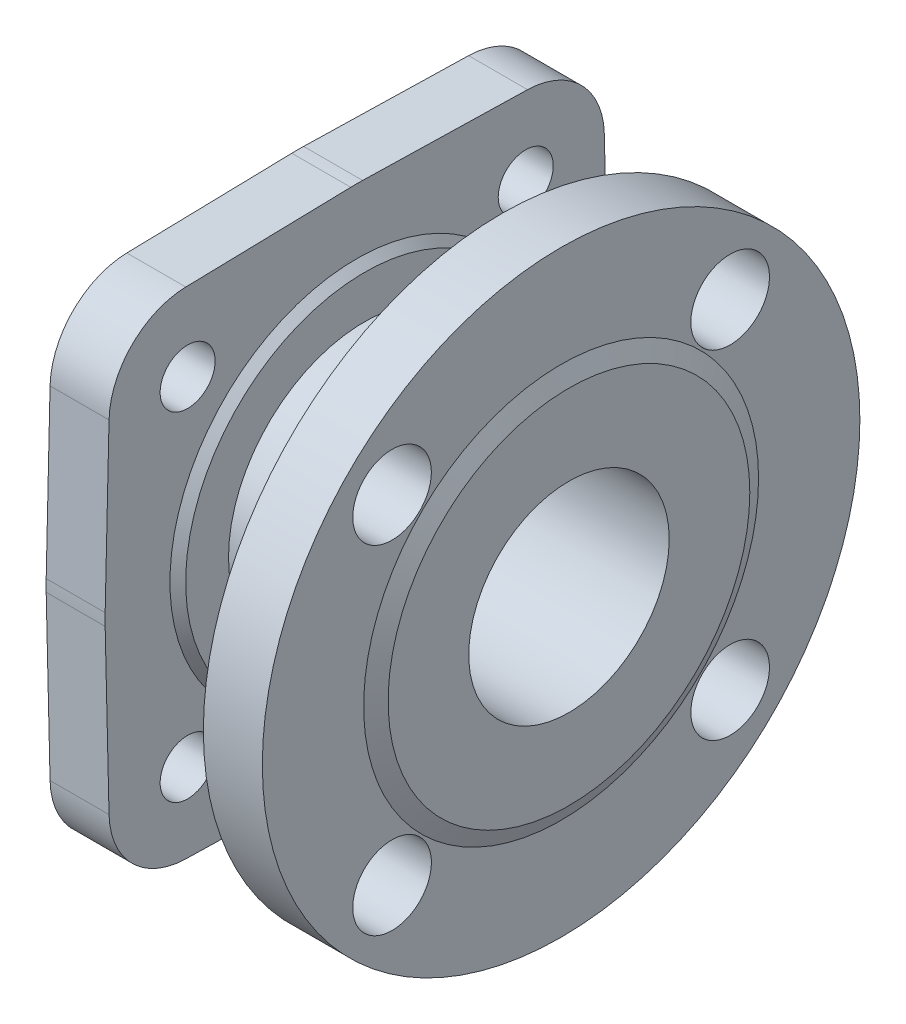
ISO-10303-21;
HEADER;
FILE_DESCRIPTION(('STEP AP214'),'2;1');
FILE_NAME('part.step','',(''),(''),'','','');
FILE_SCHEMA(('AUTOMOTIVE_DESIGN { 1 0 10303 214 1 1 1 1 }'));
ENDSEC;
DATA;
#1=APPLICATION_CONTEXT('core data for automotive mechanical design processes');
#2=APPLICATION_PROTOCOL_DEFINITION('international standard','automotive_design',2000,#1);
#3=PRODUCT_CONTEXT('',#1,'mechanical');
#4=PRODUCT('Part','Part','',(#3));
#5=PRODUCT_RELATED_PRODUCT_CATEGORY('part','',(#4));
#6=PRODUCT_DEFINITION_FORMATION('','',#4);
#7=PRODUCT_DEFINITION_CONTEXT('part definition',#1,'design');
#8=PRODUCT_DEFINITION('design','',#6,#7);
#9=PRODUCT_DEFINITION_SHAPE('','',#8);
#10=(LENGTH_UNIT() NAMED_UNIT(*) SI_UNIT(.MILLI.,.METRE.));
#11=(NAMED_UNIT(*) PLANE_ANGLE_UNIT() SI_UNIT($,.RADIAN.));
#12=(NAMED_UNIT(*) SI_UNIT($,.STERADIAN.) SOLID_ANGLE_UNIT());
#13=UNCERTAINTY_MEASURE_WITH_UNIT(LENGTH_MEASURE(1.E-05),#10,'distance_accuracy_value','');
#14=(GEOMETRIC_REPRESENTATION_CONTEXT(3) GLOBAL_UNCERTAINTY_ASSIGNED_CONTEXT((#13)) GLOBAL_UNIT_ASSIGNED_CONTEXT((#10,
#11,#12)) REPRESENTATION_CONTEXT('',''));
#15=CARTESIAN_POINT('',(0.,0.,0.));
#16=DIRECTION('',(0.,0.,1.));
#17=DIRECTION('',(1.,0.,0.));
#18=AXIS2_PLACEMENT_3D('',#15,#16,#17);
#19=CARTESIAN_POINT('',(15.,-1.50609583357717,-63.9822762594461));
#20=DIRECTION('',(0.,0.0235327473996433,0.999723066553845));
#21=DIRECTION('',(0.,-0.999723066553845,0.0235327473996433));
#22=AXIS2_PLACEMENT_3D('',#19,#20,#21);
#23=PLANE('',#22);
#24=DIRECTION('',(0.,0.999723066553846,-0.0235327473996433));
#25=VECTOR('',#24,1.);
#26=CARTESIAN_POINT('',(0.,-1.50609583357717,-63.9822762594461));
#27=LINE('',#26,#25);
#28=CARTESIAN_POINT('',(0.,-43.4706549479929,-62.9944613310769));
#29=VERTEX_POINT('',#28);
#30=CARTESIAN_POINT('',(0.,-1.50609583357715,-63.9822762594461));
#31=VERTEX_POINT('',#30);
#32=EDGE_CURVE('E196',#29,#31,#27,.T.);
#33=ORIENTED_EDGE('',*,*,#32,.T.);
#34=DIRECTION('',(-1.,0.,0.));
#35=VECTOR('',#34,1.);
#36=CARTESIAN_POINT('',(15.,-1.50609583357715,-63.9822762594461));
#37=LINE('',#36,#35);
#38=CARTESIAN_POINT('',(15.,-1.50609583357715,-63.9822762594461));
#39=VERTEX_POINT('',#38);
#40=EDGE_CURVE('E48',#39,#31,#37,.T.);
#41=ORIENTED_EDGE('',*,*,#40,.F.);
#42=DIRECTION('',(0.,0.999723066553846,-0.0235327473996433));
#43=VECTOR('',#42,1.);
#44=CARTESIAN_POINT('',(15.,-1.50609583357717,-63.9822762594461));
#45=LINE('',#44,#43);
#46=CARTESIAN_POINT('',(15.,-43.4706549479929,-62.9944613310769));
#47=VERTEX_POINT('',#46);
#48=EDGE_CURVE('E253',#47,#39,#45,.T.);
#49=ORIENTED_EDGE('',*,*,#48,.F.);
#50=DIRECTION('',(-1.,0.,0.));
#51=VECTOR('',#50,1.);
#52=CARTESIAN_POINT('',(15.,-43.4706549479929,-62.9944613310769));
#53=LINE('',#52,#51);
#54=EDGE_CURVE('E63',#47,#29,#53,.T.);
#55=ORIENTED_EDGE('',*,*,#54,.T.);
#56=EDGE_LOOP('',(#33,#41,#49,#55));
#57=FACE_BOUND('',#56,.T.);
#58=ADVANCED_FACE('F45',(#57),#23,.F.);
#59=CARTESIAN_POINT('',(15.,0.,0.));
#60=DIRECTION('',(-1.,0.,0.));
#61=DIRECTION('',(0.,0.,1.));
#62=AXIS2_PLACEMENT_3D('',#59,#60,#61);
#63=CYLINDRICAL_SURFACE('',#62,64.);
#64=CARTESIAN_POINT('',(0.,0.,0.));
#65=DIRECTION('',(1.,0.,0.));
#66=DIRECTION('',(0.,0.,-1.));
#67=AXIS2_PLACEMENT_3D('',#64,#65,#66);
#68=CIRCLE('',#67,64.);
#69=CARTESIAN_POINT('',(0.,1.50609583357715,-63.9822762594461));
#70=VERTEX_POINT('',#69);
#71=EDGE_CURVE('E199',#31,#70,#68,.T.);
#72=ORIENTED_EDGE('',*,*,#71,.T.);
#73=DIRECTION('',(-1.,0.,0.));
#74=VECTOR('',#73,1.);
#75=CARTESIAN_POINT('',(15.,1.50609583357715,-63.9822762594461));
#76=LINE('',#75,#74);
#77=CARTESIAN_POINT('',(15.,1.50609583357715,-63.9822762594461));
#78=VERTEX_POINT('',#77);
#79=EDGE_CURVE('E293',#78,#70,#76,.T.);
#80=ORIENTED_EDGE('',*,*,#79,.F.);
#81=CARTESIAN_POINT('',(15.,0.,0.));
#82=DIRECTION('',(1.,0.,0.));
#83=DIRECTION('',(0.,0.,-1.));
#84=AXIS2_PLACEMENT_3D('',#81,#82,#83);
#85=CIRCLE('',#84,64.);
#86=EDGE_CURVE('E126',#39,#78,#85,.T.);
#87=ORIENTED_EDGE('',*,*,#86,.F.);
#88=ORIENTED_EDGE('',*,*,#40,.T.);
#89=EDGE_LOOP('',(#72,#80,#87,#88));
#90=FACE_BOUND('',#89,.T.);
#91=ADVANCED_FACE('F300',(#90),#63,.T.);
#92=CARTESIAN_POINT('',(15.,1.50609583357717,-63.9822762594461));
#93=DIRECTION('',(0.,0.0235327473996433,-0.999723066553845));
#94=DIRECTION('',(0.,0.999723066553845,0.0235327473996433));
#95=AXIS2_PLACEMENT_3D('',#92,#93,#94);
#96=PLANE('',#95);
#97=DIRECTION('',(0.,-0.999723066553846,-0.0235327473996433));
#98=VECTOR('',#97,1.);
#99=CARTESIAN_POINT('',(0.,1.50609583357717,-63.9822762594461));
#100=LINE('',#99,#98);
#101=CARTESIAN_POINT('',(0.,43.4706549479929,-62.9944613310769));
#102=VERTEX_POINT('',#101);
#103=EDGE_CURVE('E204',#102,#70,#100,.T.);
#104=ORIENTED_EDGE('',*,*,#103,.F.);
#105=DIRECTION('',(-1.,0.,0.));
#106=VECTOR('',#105,1.);
#107=CARTESIAN_POINT('',(15.,43.4706549479929,-62.9944613310769));
#108=LINE('',#107,#106);
#109=CARTESIAN_POINT('',(15.,43.4706549479929,-62.9944613310769));
#110=VERTEX_POINT('',#109);
#111=EDGE_CURVE('E291',#110,#102,#108,.T.);
#112=ORIENTED_EDGE('',*,*,#111,.F.);
#113=DIRECTION('',(0.,-0.999723066553846,-0.0235327473996433));
#114=VECTOR('',#113,1.);
#115=CARTESIAN_POINT('',(15.,1.50609583357717,-63.9822762594461));
#116=LINE('',#115,#114);
#117=EDGE_CURVE('E686',#110,#78,#116,.T.);
#118=ORIENTED_EDGE('',*,*,#117,.T.);
#119=ORIENTED_EDGE('',*,*,#79,.T.);
#120=EDGE_LOOP('',(#104,#112,#118,#119));
#121=FACE_BOUND('',#120,.T.);
#122=ADVANCED_FACE('F319',(#121),#96,.T.);
#123=CARTESIAN_POINT('',(15.,43.,-43.));
#124=DIRECTION('',(-1.,0.,0.));
#125=DIRECTION('',(0.,0.,1.));
#126=AXIS2_PLACEMENT_3D('',#123,#124,#125);
#127=CYLINDRICAL_SURFACE('',#126,20.);
#128=CARTESIAN_POINT('',(0.,43.,-43.));
#129=DIRECTION('',(1.,0.,0.));
#130=DIRECTION('',(0.,0.,-1.));
#131=AXIS2_PLACEMENT_3D('',#128,#129,#130);
#132=CIRCLE('',#131,20.);
#133=CARTESIAN_POINT('',(0.,62.9944613310769,-43.4706549479929));
#134=VERTEX_POINT('',#133);
#135=EDGE_CURVE('E208',#102,#134,#132,.T.);
#136=ORIENTED_EDGE('',*,*,#135,.T.);
#137=DIRECTION('',(-1.,0.,0.));
#138=VECTOR('',#137,1.);
#139=CARTESIAN_POINT('',(15.,62.9944613310769,-43.4706549479929));
#140=LINE('',#139,#138);
#141=CARTESIAN_POINT('',(15.,62.9944613310769,-43.4706549479929));
#142=VERTEX_POINT('',#141);
#143=EDGE_CURVE('E287',#142,#134,#140,.T.);
#144=ORIENTED_EDGE('',*,*,#143,.F.);
#145=CARTESIAN_POINT('',(15.,43.,-43.));
#146=DIRECTION('',(1.,0.,0.));
#147=DIRECTION('',(0.,0.,-1.));
#148=AXIS2_PLACEMENT_3D('',#145,#146,#147);
#149=CIRCLE('',#148,20.);
#150=EDGE_CURVE('E689',#110,#142,#149,.T.);
#151=ORIENTED_EDGE('',*,*,#150,.F.);
#152=ORIENTED_EDGE('',*,*,#111,.T.);
#153=EDGE_LOOP('',(#136,#144,#151,#152));
#154=FACE_BOUND('',#153,.T.);
#155=ADVANCED_FACE('F323',(#154),#127,.T.);
#156=CARTESIAN_POINT('',(15.,63.9822762594462,-1.50609583357721));
#157=DIRECTION('',(0.,-0.999723066553845,0.0235327473996439));
#158=DIRECTION('',(0.,-0.0235327473996439,-0.999723066553845));
#159=AXIS2_PLACEMENT_3D('',#156,#157,#158);
#160=PLANE('',#159);
#161=DIRECTION('',(0.,0.0235327473996439,0.999723066553846));
#162=VECTOR('',#161,1.);
#163=CARTESIAN_POINT('',(0.,63.9822762594462,-1.50609583357721));
#164=LINE('',#163,#162);
#165=CARTESIAN_POINT('',(0.,63.9822762594462,-1.50609583357718));
#166=VERTEX_POINT('',#165);
#167=EDGE_CURVE('E211',#134,#166,#164,.T.);
#168=ORIENTED_EDGE('',*,*,#167,.T.);
#169=DIRECTION('',(-1.,0.,0.));
#170=VECTOR('',#169,1.);
#171=CARTESIAN_POINT('',(15.,63.9822762594462,-1.50609583357718));
#172=LINE('',#171,#170);
#173=CARTESIAN_POINT('',(15.,63.9822762594462,-1.50609583357718));
#174=VERTEX_POINT('',#173);
#175=EDGE_CURVE('E283',#174,#166,#172,.T.);
#176=ORIENTED_EDGE('',*,*,#175,.F.);
#177=DIRECTION('',(0.,0.0235327473996439,0.999723066553846));
#178=VECTOR('',#177,1.);
#179=CARTESIAN_POINT('',(15.,63.9822762594462,-1.50609583357721));
#180=LINE('',#179,#178);
#181=EDGE_CURVE('E692',#142,#174,#180,.T.);
#182=ORIENTED_EDGE('',*,*,#181,.F.);
#183=ORIENTED_EDGE('',*,*,#143,.T.);
#184=EDGE_LOOP('',(#168,#176,#182,#183));
#185=FACE_BOUND('',#184,.T.);
#186=ADVANCED_FACE('F328',(#185),#160,.F.);
#187=CARTESIAN_POINT('',(15.,0.,0.));
#188=DIRECTION('',(-1.,0.,0.));
#189=DIRECTION('',(0.,0.,1.));
#190=AXIS2_PLACEMENT_3D('',#187,#188,#189);
#191=CYLINDRICAL_SURFACE('',#190,64.);
#192=CARTESIAN_POINT('',(0.,0.,0.));
#193=DIRECTION('',(1.,0.,0.));
#194=DIRECTION('',(0.,0.,-1.));
#195=AXIS2_PLACEMENT_3D('',#192,#193,#194);
#196=CIRCLE('',#195,64.);
#197=CARTESIAN_POINT('',(0.,63.9822762594462,1.50609583357718));
#198=VERTEX_POINT('',#197);
#199=EDGE_CURVE('E214',#166,#198,#196,.T.);
#200=ORIENTED_EDGE('',*,*,#199,.T.);
#201=DIRECTION('',(-1.,0.,0.));
#202=VECTOR('',#201,1.);
#203=CARTESIAN_POINT('',(15.,63.9822762594462,1.50609583357718));
#204=LINE('',#203,#202);
#205=CARTESIAN_POINT('',(15.,63.9822762594462,1.50609583357718));
#206=VERTEX_POINT('',#205);
#207=EDGE_CURVE('E280',#206,#198,#204,.T.);
#208=ORIENTED_EDGE('',*,*,#207,.F.);
#209=CARTESIAN_POINT('',(15.,0.,0.));
#210=DIRECTION('',(1.,0.,0.));
#211=DIRECTION('',(0.,0.,-1.));
#212=AXIS2_PLACEMENT_3D('',#209,#210,#211);
#213=CIRCLE('',#212,64.);
#214=EDGE_CURVE('E695',#174,#206,#213,.T.);
#215=ORIENTED_EDGE('',*,*,#214,.F.);
#216=ORIENTED_EDGE('',*,*,#175,.T.);
#217=EDGE_LOOP('',(#200,#208,#215,#216));
#218=FACE_BOUND('',#217,.T.);
#219=ADVANCED_FACE('F332',(#218),#191,.T.);
#220=CARTESIAN_POINT('',(15.,63.9822762594462,1.50609583357721));
#221=DIRECTION('',(0.,0.999723066553845,0.0235327473996439));
#222=DIRECTION('',(0.,-0.0235327473996439,0.999723066553845));
#223=AXIS2_PLACEMENT_3D('',#220,#221,#222);
#224=PLANE('',#223);
#225=DIRECTION('',(0.,0.0235327473996439,-0.999723066553846));
#226=VECTOR('',#225,1.);
#227=CARTESIAN_POINT('',(0.,63.9822762594462,1.50609583357721));
#228=LINE('',#227,#226);
#229=CARTESIAN_POINT('',(0.,62.9944613310769,43.4706549479929));
#230=VERTEX_POINT('',#229);
#231=EDGE_CURVE('E218',#230,#198,#228,.T.);
#232=ORIENTED_EDGE('',*,*,#231,.F.);
#233=DIRECTION('',(-1.,0.,0.));
#234=VECTOR('',#233,1.);
#235=CARTESIAN_POINT('',(15.,62.9944613310769,43.4706549479929));
#236=LINE('',#235,#234);
#237=CARTESIAN_POINT('',(15.,62.9944613310769,43.4706549479929));
#238=VERTEX_POINT('',#237);
#239=EDGE_CURVE('E277',#238,#230,#236,.T.);
#240=ORIENTED_EDGE('',*,*,#239,.F.);
#241=DIRECTION('',(0.,0.0235327473996439,-0.999723066553846));
#242=VECTOR('',#241,1.);
#243=CARTESIAN_POINT('',(15.,63.9822762594462,1.50609583357721));
#244=LINE('',#243,#242);
#245=EDGE_CURVE('E698',#238,#206,#244,.T.);
#246=ORIENTED_EDGE('',*,*,#245,.T.);
#247=ORIENTED_EDGE('',*,*,#207,.T.);
#248=EDGE_LOOP('',(#232,#240,#246,#247));
#249=FACE_BOUND('',#248,.T.);
#250=ADVANCED_FACE('F336',(#249),#224,.T.);
#251=CARTESIAN_POINT('',(15.,43.,43.));
#252=DIRECTION('',(-1.,0.,0.));
#253=DIRECTION('',(0.,0.,1.));
#254=AXIS2_PLACEMENT_3D('',#251,#252,#253);
#255=CYLINDRICAL_SURFACE('',#254,20.);
#256=CARTESIAN_POINT('',(0.,43.,43.));
#257=DIRECTION('',(1.,0.,0.));
#258=DIRECTION('',(0.,0.,-1.));
#259=AXIS2_PLACEMENT_3D('',#256,#257,#258);
#260=CIRCLE('',#259,20.);
#261=CARTESIAN_POINT('',(0.,43.4706549479929,62.9944613310769));
#262=VERTEX_POINT('',#261);
#263=EDGE_CURVE('E222',#262,#230,#260,.F.);
#264=ORIENTED_EDGE('',*,*,#263,.F.);
#265=DIRECTION('',(-1.,0.,0.));
#266=VECTOR('',#265,1.);
#267=CARTESIAN_POINT('',(15.,43.4706549479929,62.9944613310769));
#268=LINE('',#267,#266);
#269=CARTESIAN_POINT('',(15.,43.4706549479929,62.9944613310769));
#270=VERTEX_POINT('',#269);
#271=EDGE_CURVE('E274',#270,#262,#268,.T.);
#272=ORIENTED_EDGE('',*,*,#271,.F.);
#273=CARTESIAN_POINT('',(15.,43.,43.));
#274=DIRECTION('',(1.,0.,0.));
#275=DIRECTION('',(0.,0.,-1.));
#276=AXIS2_PLACEMENT_3D('',#273,#274,#275);
#277=CIRCLE('',#276,20.);
#278=EDGE_CURVE('E702',#270,#238,#277,.F.);
#279=ORIENTED_EDGE('',*,*,#278,.T.);
#280=ORIENTED_EDGE('',*,*,#239,.T.);
#281=EDGE_LOOP('',(#264,#272,#279,#280));
#282=FACE_BOUND('',#281,.T.);
#283=ADVANCED_FACE('F340',(#282),#255,.T.);
#284=CARTESIAN_POINT('',(15.,1.50609583357717,63.9822762594461));
#285=DIRECTION('',(0.,-0.0235327473996433,-0.999723066553845));
#286=DIRECTION('',(0.,0.999723066553845,-0.0235327473996433));
#287=AXIS2_PLACEMENT_3D('',#284,#285,#286);
#288=PLANE('',#287);
#289=DIRECTION('',(0.,-0.999723066553846,0.0235327473996433));
#290=VECTOR('',#289,1.);
#291=CARTESIAN_POINT('',(0.,1.50609583357717,63.9822762594461));
#292=LINE('',#291,#290);
#293=CARTESIAN_POINT('',(0.,1.50609583357715,63.9822762594461));
#294=VERTEX_POINT('',#293);
#295=EDGE_CURVE('E226',#262,#294,#292,.T.);
#296=ORIENTED_EDGE('',*,*,#295,.T.);
#297=DIRECTION('',(-1.,0.,0.));
#298=VECTOR('',#297,1.);
#299=CARTESIAN_POINT('',(15.,1.50609583357715,63.9822762594461));
#300=LINE('',#299,#298);
#301=CARTESIAN_POINT('',(15.,1.50609583357715,63.9822762594461));
#302=VERTEX_POINT('',#301);
#303=EDGE_CURVE('E270',#302,#294,#300,.T.);
#304=ORIENTED_EDGE('',*,*,#303,.F.);
#305=DIRECTION('',(0.,-0.999723066553846,0.0235327473996433));
#306=VECTOR('',#305,1.);
#307=CARTESIAN_POINT('',(15.,1.50609583357717,63.9822762594461));
#308=LINE('',#307,#306);
#309=EDGE_CURVE('E706',#270,#302,#308,.T.);
#310=ORIENTED_EDGE('',*,*,#309,.F.);
#311=ORIENTED_EDGE('',*,*,#271,.T.);
#312=EDGE_LOOP('',(#296,#304,#310,#311));
#313=FACE_BOUND('',#312,.T.);
#314=ADVANCED_FACE('F344',(#313),#288,.F.);
#315=CARTESIAN_POINT('',(15.,0.,0.));
#316=DIRECTION('',(-1.,0.,0.));
#317=DIRECTION('',(0.,0.,1.));
#318=AXIS2_PLACEMENT_3D('',#315,#316,#317);
#319=CYLINDRICAL_SURFACE('',#318,64.);
#320=CARTESIAN_POINT('',(0.,0.,0.));
#321=DIRECTION('',(1.,0.,0.));
#322=DIRECTION('',(0.,0.,-1.));
#323=AXIS2_PLACEMENT_3D('',#320,#321,#322);
#324=CIRCLE('',#323,64.);
#325=CARTESIAN_POINT('',(0.,-1.50609583357715,63.9822762594461));
#326=VERTEX_POINT('',#325);
#327=EDGE_CURVE('E229',#294,#326,#324,.T.);
#328=ORIENTED_EDGE('',*,*,#327,.T.);
#329=DIRECTION('',(-1.,0.,0.));
#330=VECTOR('',#329,1.);
#331=CARTESIAN_POINT('',(15.,-1.50609583357715,63.9822762594461));
#332=LINE('',#331,#330);
#333=CARTESIAN_POINT('',(15.,-1.50609583357715,63.9822762594461));
#334=VERTEX_POINT('',#333);
#335=EDGE_CURVE('E267',#334,#326,#332,.T.);
#336=ORIENTED_EDGE('',*,*,#335,.F.);
#337=CARTESIAN_POINT('',(15.,0.,0.));
#338=DIRECTION('',(1.,0.,0.));
#339=DIRECTION('',(0.,0.,-1.));
#340=AXIS2_PLACEMENT_3D('',#337,#338,#339);
#341=CIRCLE('',#340,64.);
#342=EDGE_CURVE('E709',#302,#334,#341,.T.);
#343=ORIENTED_EDGE('',*,*,#342,.F.);
#344=ORIENTED_EDGE('',*,*,#303,.T.);
#345=EDGE_LOOP('',(#328,#336,#343,#344));
#346=FACE_BOUND('',#345,.T.);
#347=ADVANCED_FACE('F348',(#346),#319,.T.);
#348=CARTESIAN_POINT('',(15.,-1.50609583357717,63.9822762594461));
#349=DIRECTION('',(0.,-0.0235327473996433,0.999723066553845));
#350=DIRECTION('',(0.,-0.999723066553845,-0.0235327473996433));
#351=AXIS2_PLACEMENT_3D('',#348,#349,#350);
#352=PLANE('',#351);
#353=DIRECTION('',(0.,0.999723066553846,0.0235327473996433));
#354=VECTOR('',#353,1.);
#355=CARTESIAN_POINT('',(0.,-1.50609583357717,63.9822762594461));
#356=LINE('',#355,#354);
#357=CARTESIAN_POINT('',(0.,-43.4706549479929,62.9944613310769));
#358=VERTEX_POINT('',#357);
#359=EDGE_CURVE('E233',#358,#326,#356,.T.);
#360=ORIENTED_EDGE('',*,*,#359,.F.);
#361=DIRECTION('',(-1.,0.,0.));
#362=VECTOR('',#361,1.);
#363=CARTESIAN_POINT('',(15.,-43.4706549479929,62.9944613310769));
#364=LINE('',#363,#362);
#365=CARTESIAN_POINT('',(15.,-43.4706549479929,62.9944613310769));
#366=VERTEX_POINT('',#365);
#367=EDGE_CURVE('E264',#366,#358,#364,.T.);
#368=ORIENTED_EDGE('',*,*,#367,.F.);
#369=DIRECTION('',(0.,0.999723066553846,0.0235327473996433));
#370=VECTOR('',#369,1.);
#371=CARTESIAN_POINT('',(15.,-1.50609583357717,63.9822762594461));
#372=LINE('',#371,#370);
#373=EDGE_CURVE('E712',#366,#334,#372,.T.);
#374=ORIENTED_EDGE('',*,*,#373,.T.);
#375=ORIENTED_EDGE('',*,*,#335,.T.);
#376=EDGE_LOOP('',(#360,#368,#374,#375));
#377=FACE_BOUND('',#376,.T.);
#378=ADVANCED_FACE('F352',(#377),#352,.T.);
#379=CARTESIAN_POINT('',(15.,-43.,43.));
#380=DIRECTION('',(-1.,0.,0.));
#381=DIRECTION('',(0.,0.,1.));
#382=AXIS2_PLACEMENT_3D('',#379,#380,#381);
#383=CYLINDRICAL_SURFACE('',#382,20.);
#384=CARTESIAN_POINT('',(0.,-43.,43.));
#385=DIRECTION('',(1.,0.,0.));
#386=DIRECTION('',(0.,0.,-1.));
#387=AXIS2_PLACEMENT_3D('',#384,#385,#386);
#388=CIRCLE('',#387,20.);
#389=CARTESIAN_POINT('',(0.,-62.9944613310769,43.4706549479929));
#390=VERTEX_POINT('',#389);
#391=EDGE_CURVE('E237',#358,#390,#388,.T.);
#392=ORIENTED_EDGE('',*,*,#391,.T.);
#393=DIRECTION('',(-1.,0.,0.));
#394=VECTOR('',#393,1.);
#395=CARTESIAN_POINT('',(15.,-62.9944613310769,43.4706549479929));
#396=LINE('',#395,#394);
#397=CARTESIAN_POINT('',(15.,-62.9944613310769,43.4706549479929));
#398=VERTEX_POINT('',#397);
#399=EDGE_CURVE('E260',#398,#390,#396,.T.);
#400=ORIENTED_EDGE('',*,*,#399,.F.);
#401=CARTESIAN_POINT('',(15.,-43.,43.));
#402=DIRECTION('',(1.,0.,0.));
#403=DIRECTION('',(0.,0.,-1.));
#404=AXIS2_PLACEMENT_3D('',#401,#402,#403);
#405=CIRCLE('',#404,20.);
#406=EDGE_CURVE('E716',#366,#398,#405,.T.);
#407=ORIENTED_EDGE('',*,*,#406,.F.);
#408=ORIENTED_EDGE('',*,*,#367,.T.);
#409=EDGE_LOOP('',(#392,#400,#407,#408));
#410=FACE_BOUND('',#409,.T.);
#411=ADVANCED_FACE('F356',(#410),#383,.T.);
#412=CARTESIAN_POINT('',(15.,-63.9822762594462,1.50609583357721));
#413=DIRECTION('',(0.,0.999723066553845,-0.0235327473996439));
#414=DIRECTION('',(0.,0.0235327473996439,0.999723066553845));
#415=AXIS2_PLACEMENT_3D('',#412,#413,#414);
#416=PLANE('',#415);
#417=DIRECTION('',(0.,-0.0235327473996439,-0.999723066553846));
#418=VECTOR('',#417,1.);
#419=CARTESIAN_POINT('',(0.,-63.9822762594462,1.50609583357721));
#420=LINE('',#419,#418);
#421=CARTESIAN_POINT('',(0.,-63.9822762594462,1.50609583357718));
#422=VERTEX_POINT('',#421);
#423=EDGE_CURVE('E240',#390,#422,#420,.T.);
#424=ORIENTED_EDGE('',*,*,#423,.T.);
#425=DIRECTION('',(-1.,0.,0.));
#426=VECTOR('',#425,1.);
#427=CARTESIAN_POINT('',(15.,-63.9822762594462,1.50609583357718));
#428=LINE('',#427,#426);
#429=CARTESIAN_POINT('',(15.,-63.9822762594462,1.50609583357718));
#430=VERTEX_POINT('',#429);
#431=EDGE_CURVE('E176',#430,#422,#428,.T.);
#432=ORIENTED_EDGE('',*,*,#431,.F.);
#433=DIRECTION('',(0.,-0.0235327473996439,-0.999723066553846));
#434=VECTOR('',#433,1.);
#435=CARTESIAN_POINT('',(15.,-63.9822762594462,1.50609583357721));
#436=LINE('',#435,#434);
#437=EDGE_CURVE('E184',#398,#430,#436,.T.);
#438=ORIENTED_EDGE('',*,*,#437,.F.);
#439=ORIENTED_EDGE('',*,*,#399,.T.);
#440=EDGE_LOOP('',(#424,#432,#438,#439));
#441=FACE_BOUND('',#440,.T.);
#442=ADVANCED_FACE('F360',(#441),#416,.F.);
#443=CARTESIAN_POINT('',(15.,0.,0.));
#444=DIRECTION('',(-1.,0.,0.));
#445=DIRECTION('',(0.,0.,1.));
#446=AXIS2_PLACEMENT_3D('',#443,#444,#445);
#447=CYLINDRICAL_SURFACE('',#446,64.);
#448=CARTESIAN_POINT('',(0.,0.,0.));
#449=DIRECTION('',(1.,0.,0.));
#450=DIRECTION('',(0.,0.,-1.));
#451=AXIS2_PLACEMENT_3D('',#448,#449,#450);
#452=CIRCLE('',#451,64.);
#453=CARTESIAN_POINT('',(0.,-63.9822762594462,-1.50609583357718));
#454=VERTEX_POINT('',#453);
#455=EDGE_CURVE('E171',#454,#422,#452,.F.);
#456=ORIENTED_EDGE('',*,*,#455,.F.);
#457=DIRECTION('',(-1.,0.,0.));
#458=VECTOR('',#457,1.);
#459=CARTESIAN_POINT('',(15.,-63.9822762594462,-1.50609583357718));
#460=LINE('',#459,#458);
#461=CARTESIAN_POINT('',(15.,-63.9822762594462,-1.50609583357718));
#462=VERTEX_POINT('',#461);
#463=EDGE_CURVE('E166',#462,#454,#460,.T.);
#464=ORIENTED_EDGE('',*,*,#463,.F.);
#465=CARTESIAN_POINT('',(15.,0.,0.));
#466=DIRECTION('',(1.,0.,0.));
#467=DIRECTION('',(0.,0.,-1.));
#468=AXIS2_PLACEMENT_3D('',#465,#466,#467);
#469=CIRCLE('',#468,64.);
#470=EDGE_CURVE('E169',#462,#430,#469,.F.);
#471=ORIENTED_EDGE('',*,*,#470,.T.);
#472=ORIENTED_EDGE('',*,*,#431,.T.);
#473=EDGE_LOOP('',(#456,#464,#471,#472));
#474=FACE_BOUND('',#473,.T.);
#475=ADVANCED_FACE('F168',(#474),#447,.T.);
#476=CARTESIAN_POINT('',(15.,-63.9822762594462,-1.50609583357721));
#477=DIRECTION('',(0.,-0.999723066553845,-0.0235327473996439));
#478=DIRECTION('',(0.,0.0235327473996439,-0.999723066553845));
#479=AXIS2_PLACEMENT_3D('',#476,#477,#478);
#480=PLANE('',#479);
#481=DIRECTION('',(0.,-0.0235327473996439,0.999723066553846));
#482=VECTOR('',#481,1.);
#483=CARTESIAN_POINT('',(0.,-63.9822762594462,-1.50609583357721));
#484=LINE('',#483,#482);
#485=CARTESIAN_POINT('',(0.,-62.9944613310769,-43.4706549479929));
#486=VERTEX_POINT('',#485);
#487=EDGE_CURVE('E246',#486,#454,#484,.T.);
#488=ORIENTED_EDGE('',*,*,#487,.F.);
#489=DIRECTION('',(-1.,0.,0.));
#490=VECTOR('',#489,1.);
#491=CARTESIAN_POINT('',(15.,-62.9944613310769,-43.4706549479929));
#492=LINE('',#491,#490);
#493=CARTESIAN_POINT('',(15.,-62.9944613310769,-43.4706549479929));
#494=VERTEX_POINT('',#493);
#495=EDGE_CURVE('E113',#494,#486,#492,.T.);
#496=ORIENTED_EDGE('',*,*,#495,.F.);
#497=DIRECTION('',(0.,-0.0235327473996439,0.999723066553846));
#498=VECTOR('',#497,1.);
#499=CARTESIAN_POINT('',(15.,-63.9822762594462,-1.50609583357721));
#500=LINE('',#499,#498);
#501=EDGE_CURVE('E182',#494,#462,#500,.T.);
#502=ORIENTED_EDGE('',*,*,#501,.T.);
#503=ORIENTED_EDGE('',*,*,#463,.T.);
#504=EDGE_LOOP('',(#488,#496,#502,#503));
#505=FACE_BOUND('',#504,.T.);
#506=ADVANCED_FACE('F188',(#505),#480,.T.);
#507=CARTESIAN_POINT('',(15.,-43.,-43.));
#508=DIRECTION('',(-1.,0.,0.));
#509=DIRECTION('',(0.,0.,1.));
#510=AXIS2_PLACEMENT_3D('',#507,#508,#509);
#511=CYLINDRICAL_SURFACE('',#510,20.);
#512=CARTESIAN_POINT('',(0.,-43.,-43.));
#513=DIRECTION('',(1.,0.,0.));
#514=DIRECTION('',(0.,0.,-1.));
#515=AXIS2_PLACEMENT_3D('',#512,#513,#514);
#516=CIRCLE('',#515,20.);
#517=EDGE_CURVE('E249',#29,#486,#516,.F.);
#518=ORIENTED_EDGE('',*,*,#517,.F.);
#519=ORIENTED_EDGE('',*,*,#54,.F.);
#520=CARTESIAN_POINT('',(15.,-43.,-43.));
#521=DIRECTION('',(1.,0.,0.));
#522=DIRECTION('',(0.,0.,-1.));
#523=AXIS2_PLACEMENT_3D('',#520,#521,#522);
#524=CIRCLE('',#523,20.);
#525=EDGE_CURVE('E190',#47,#494,#524,.F.);
#526=ORIENTED_EDGE('',*,*,#525,.T.);
#527=ORIENTED_EDGE('',*,*,#495,.T.);
#528=EDGE_LOOP('',(#518,#519,#526,#527));
#529=FACE_BOUND('',#528,.T.);
#530=ADVANCED_FACE('F303',(#529),#511,.T.);
#531=CARTESIAN_POINT('',(15.,0.,0.));
#532=DIRECTION('',(1.,0.,0.));
#533=DIRECTION('',(0.,0.,-1.));
#534=AXIS2_PLACEMENT_3D('',#531,#532,#533);
#535=PLANE('',#534);
#536=CARTESIAN_POINT('',(15.,0.,0.));
#537=DIRECTION('',(1.,0.,0.));
#538=DIRECTION('',(0.,0.,-1.));
#539=AXIS2_PLACEMENT_3D('',#536,#537,#538);
#540=CIRCLE('',#539,47.5);
#541=CARTESIAN_POINT('',(15.,0.,-47.5));
#542=VERTEX_POINT('',#541);
#543=EDGE_CURVE('E11',#542,#542,#540,.T.);
#544=ORIENTED_EDGE('',*,*,#543,.F.);
#545=EDGE_LOOP('',(#544));
#546=FACE_BOUND('',#545,.T.);
#547=CARTESIAN_POINT('',(15.,-43.,43.));
#548=DIRECTION('',(1.,0.,0.));
#549=DIRECTION('',(0.,0.,1.));
#550=AXIS2_PLACEMENT_3D('',#547,#548,#549);
#551=CIRCLE('',#550,7.);
#552=CARTESIAN_POINT('',(15.,-43.,50.));
#553=VERTEX_POINT('',#552);
#554=EDGE_CURVE('E669',#553,#553,#551,.T.);
#555=ORIENTED_EDGE('',*,*,#554,.F.);
#556=EDGE_LOOP('',(#555));
#557=FACE_BOUND('',#556,.T.);
#558=CARTESIAN_POINT('',(15.,-43.,-43.));
#559=DIRECTION('',(1.,0.,0.));
#560=DIRECTION('',(0.,0.,-1.));
#561=AXIS2_PLACEMENT_3D('',#558,#559,#560);
#562=CIRCLE('',#561,7.);
#563=CARTESIAN_POINT('',(15.,-43.,-50.));
#564=VERTEX_POINT('',#563);
#565=EDGE_CURVE('E661',#564,#564,#562,.T.);
#566=ORIENTED_EDGE('',*,*,#565,.F.);
#567=EDGE_LOOP('',(#566));
#568=FACE_BOUND('',#567,.T.);
#569=CARTESIAN_POINT('',(15.,43.,-43.));
#570=DIRECTION('',(1.,0.,0.));
#571=DIRECTION('',(0.,0.,1.));
#572=AXIS2_PLACEMENT_3D('',#569,#570,#571);
#573=CIRCLE('',#572,7.);
#574=CARTESIAN_POINT('',(15.,43.,-36.));
#575=VERTEX_POINT('',#574);
#576=EDGE_CURVE('E652',#575,#575,#573,.T.);
#577=ORIENTED_EDGE('',*,*,#576,.F.);
#578=EDGE_LOOP('',(#577));
#579=FACE_BOUND('',#578,.T.);
#580=CARTESIAN_POINT('',(15.,43.,43.));
#581=DIRECTION('',(1.,0.,0.));
#582=DIRECTION('',(0.,0.,-1.));
#583=AXIS2_PLACEMENT_3D('',#580,#581,#582);
#584=CIRCLE('',#583,7.);
#585=CARTESIAN_POINT('',(15.,43.,36.));
#586=VERTEX_POINT('',#585);
#587=EDGE_CURVE('E656',#586,#586,#584,.T.);
#588=ORIENTED_EDGE('',*,*,#587,.F.);
#589=EDGE_LOOP('',(#588));
#590=FACE_BOUND('',#589,.T.);
#591=ORIENTED_EDGE('',*,*,#48,.T.);
#592=ORIENTED_EDGE('',*,*,#86,.T.);
#593=ORIENTED_EDGE('',*,*,#117,.F.);
#594=ORIENTED_EDGE('',*,*,#150,.T.);
#595=ORIENTED_EDGE('',*,*,#181,.T.);
#596=ORIENTED_EDGE('',*,*,#214,.T.);
#597=ORIENTED_EDGE('',*,*,#245,.F.);
#598=ORIENTED_EDGE('',*,*,#278,.F.);
#599=ORIENTED_EDGE('',*,*,#309,.T.);
#600=ORIENTED_EDGE('',*,*,#342,.T.);
#601=ORIENTED_EDGE('',*,*,#373,.F.);
#602=ORIENTED_EDGE('',*,*,#406,.T.);
#603=ORIENTED_EDGE('',*,*,#437,.T.);
#604=ORIENTED_EDGE('',*,*,#470,.F.);
#605=ORIENTED_EDGE('',*,*,#501,.F.);
#606=ORIENTED_EDGE('',*,*,#525,.F.);
#607=EDGE_LOOP('',(#591,#592,#593,#594,#595,#596,#597,#598,#599,#600,#601,#602,#603,#604,#605,#606));
#608=FACE_BOUND('',#607,.T.);
#609=ADVANCED_FACE('F180',(#546,#557,#568,#579,#590,#608),#535,.T.);
#610=CARTESIAN_POINT('',(0.,0.,0.));
#611=DIRECTION('',(1.,0.,0.));
#612=DIRECTION('',(0.,0.,-1.));
#613=AXIS2_PLACEMENT_3D('',#610,#611,#612);
#614=PLANE('',#613);
#615=CARTESIAN_POINT('',(0.,0.,0.));
#616=DIRECTION('',(1.,0.,0.));
#617=DIRECTION('',(0.,0.,-1.));
#618=AXIS2_PLACEMENT_3D('',#615,#616,#617);
#619=CIRCLE('',#618,25.5);
#620=CARTESIAN_POINT('',(0.,0.,-25.5));
#621=VERTEX_POINT('',#620);
#622=EDGE_CURVE('E612',#621,#621,#619,.T.);
#623=ORIENTED_EDGE('',*,*,#622,.T.);
#624=EDGE_LOOP('',(#623));
#625=FACE_BOUND('',#624,.T.);
#626=CARTESIAN_POINT('',(0.,-43.,43.));
#627=DIRECTION('',(1.,0.,0.));
#628=DIRECTION('',(0.,0.,1.));
#629=AXIS2_PLACEMENT_3D('',#626,#627,#628);
#630=CIRCLE('',#629,7.);
#631=CARTESIAN_POINT('',(0.,-43.,50.));
#632=VERTEX_POINT('',#631);
#633=EDGE_CURVE('E650',#632,#632,#630,.T.);
#634=ORIENTED_EDGE('',*,*,#633,.T.);
#635=EDGE_LOOP('',(#634));
#636=FACE_BOUND('',#635,.T.);
#637=CARTESIAN_POINT('',(0.,-43.,-43.));
#638=DIRECTION('',(1.,0.,0.));
#639=DIRECTION('',(0.,0.,-1.));
#640=AXIS2_PLACEMENT_3D('',#637,#638,#639);
#641=CIRCLE('',#640,7.);
#642=CARTESIAN_POINT('',(0.,-43.,-50.));
#643=VERTEX_POINT('',#642);
#644=EDGE_CURVE('E665',#643,#643,#641,.T.);
#645=ORIENTED_EDGE('',*,*,#644,.T.);
#646=EDGE_LOOP('',(#645));
#647=FACE_BOUND('',#646,.T.);
#648=CARTESIAN_POINT('',(0.,43.,-43.));
#649=DIRECTION('',(1.,0.,0.));
#650=DIRECTION('',(0.,0.,1.));
#651=AXIS2_PLACEMENT_3D('',#648,#649,#650);
#652=CIRCLE('',#651,7.);
#653=CARTESIAN_POINT('',(0.,43.,-36.));
#654=VERTEX_POINT('',#653);
#655=EDGE_CURVE('E657',#654,#654,#652,.T.);
#656=ORIENTED_EDGE('',*,*,#655,.T.);
#657=EDGE_LOOP('',(#656));
#658=FACE_BOUND('',#657,.T.);
#659=CARTESIAN_POINT('',(0.,43.,43.));
#660=DIRECTION('',(1.,0.,0.));
#661=DIRECTION('',(0.,0.,-1.));
#662=AXIS2_PLACEMENT_3D('',#659,#660,#661);
#663=CIRCLE('',#662,7.);
#664=CARTESIAN_POINT('',(0.,43.,36.));
#665=VERTEX_POINT('',#664);
#666=EDGE_CURVE('E200',#665,#665,#663,.T.);
#667=ORIENTED_EDGE('',*,*,#666,.T.);
#668=EDGE_LOOP('',(#667));
#669=FACE_BOUND('',#668,.T.);
#670=ORIENTED_EDGE('',*,*,#32,.F.);
#671=ORIENTED_EDGE('',*,*,#517,.T.);
#672=ORIENTED_EDGE('',*,*,#487,.T.);
#673=ORIENTED_EDGE('',*,*,#455,.T.);
#674=ORIENTED_EDGE('',*,*,#423,.F.);
#675=ORIENTED_EDGE('',*,*,#391,.F.);
#676=ORIENTED_EDGE('',*,*,#359,.T.);
#677=ORIENTED_EDGE('',*,*,#327,.F.);
#678=ORIENTED_EDGE('',*,*,#295,.F.);
#679=ORIENTED_EDGE('',*,*,#263,.T.);
#680=ORIENTED_EDGE('',*,*,#231,.T.);
#681=ORIENTED_EDGE('',*,*,#199,.F.);
#682=ORIENTED_EDGE('',*,*,#167,.F.);
#683=ORIENTED_EDGE('',*,*,#135,.F.);
#684=ORIENTED_EDGE('',*,*,#103,.T.);
#685=ORIENTED_EDGE('',*,*,#71,.F.);
#686=EDGE_LOOP('',(#670,#671,#672,#673,#674,#675,#676,#677,#678,#679,#680,#681,#682,#683,#684,#685));
#687=FACE_BOUND('',#686,.T.);
#688=ADVANCED_FACE('F302',(#625,#636,#647,#658,#669,#687),#614,.F.);
#689=CARTESIAN_POINT('',(0.,43.,43.));
#690=DIRECTION('',(1.,0.,0.));
#691=DIRECTION('',(0.,0.,-1.));
#692=AXIS2_PLACEMENT_3D('',#689,#690,#691);
#693=CYLINDRICAL_SURFACE('',#692,7.);
#694=ORIENTED_EDGE('',*,*,#666,.F.);
#695=EDGE_LOOP('',(#694));
#696=FACE_BOUND('',#695,.T.);
#697=ORIENTED_EDGE('',*,*,#587,.T.);
#698=EDGE_LOOP('',(#697));
#699=FACE_BOUND('',#698,.T.);
#700=ADVANCED_FACE('F398',(#696,#699),#693,.F.);
#701=CARTESIAN_POINT('',(0.,43.,-43.));
#702=DIRECTION('',(1.,0.,0.));
#703=DIRECTION('',(0.,0.,-1.));
#704=AXIS2_PLACEMENT_3D('',#701,#702,#703);
#705=CYLINDRICAL_SURFACE('',#704,7.);
#706=ORIENTED_EDGE('',*,*,#655,.F.);
#707=EDGE_LOOP('',(#706));
#708=FACE_BOUND('',#707,.T.);
#709=ORIENTED_EDGE('',*,*,#576,.T.);
#710=EDGE_LOOP('',(#709));
#711=FACE_BOUND('',#710,.T.);
#712=ADVANCED_FACE('F408',(#708,#711),#705,.F.);
#713=CARTESIAN_POINT('',(0.,-43.,-43.));
#714=DIRECTION('',(1.,0.,0.));
#715=DIRECTION('',(0.,0.,-1.));
#716=AXIS2_PLACEMENT_3D('',#713,#714,#715);
#717=CYLINDRICAL_SURFACE('',#716,7.);
#718=ORIENTED_EDGE('',*,*,#644,.F.);
#719=EDGE_LOOP('',(#718));
#720=FACE_BOUND('',#719,.T.);
#721=ORIENTED_EDGE('',*,*,#565,.T.);
#722=EDGE_LOOP('',(#721));
#723=FACE_BOUND('',#722,.T.);
#724=ADVANCED_FACE('F418',(#720,#723),#717,.F.);
#725=CARTESIAN_POINT('',(0.,-43.,43.));
#726=DIRECTION('',(1.,0.,0.));
#727=DIRECTION('',(0.,0.,-1.));
#728=AXIS2_PLACEMENT_3D('',#725,#726,#727);
#729=CYLINDRICAL_SURFACE('',#728,7.);
#730=ORIENTED_EDGE('',*,*,#633,.F.);
#731=EDGE_LOOP('',(#730));
#732=FACE_BOUND('',#731,.T.);
#733=ORIENTED_EDGE('',*,*,#554,.T.);
#734=EDGE_LOOP('',(#733));
#735=FACE_BOUND('',#734,.T.);
#736=ADVANCED_FACE('F428',(#732,#735),#729,.F.);
#737=CARTESIAN_POINT('',(17.,0.,0.));
#738=DIRECTION('',(-1.,0.,0.));
#739=DIRECTION('',(0.,0.,1.));
#740=AXIS2_PLACEMENT_3D('',#737,#738,#739);
#741=CONICAL_SURFACE('',#740,45.5,0.785398163397447);
#742=ORIENTED_EDGE('',*,*,#543,.T.);
#743=EDGE_LOOP('',(#742));
#744=FACE_BOUND('',#743,.T.);
#745=CARTESIAN_POINT('',(17.,0.,0.));
#746=DIRECTION('',(1.,0.,0.));
#747=DIRECTION('',(0.,0.,-1.));
#748=AXIS2_PLACEMENT_3D('',#745,#746,#747);
#749=CIRCLE('',#748,45.5);
#750=CARTESIAN_POINT('',(17.,0.,-45.5));
#751=VERTEX_POINT('',#750);
#752=EDGE_CURVE('E647',#751,#751,#749,.T.);
#753=ORIENTED_EDGE('',*,*,#752,.F.);
#754=EDGE_LOOP('',(#753));
#755=FACE_BOUND('',#754,.T.);
#756=ADVANCED_FACE('F437',(#744,#755),#741,.T.);
#757=CARTESIAN_POINT('',(17.,45.5,0.));
#758=DIRECTION('',(1.,0.,0.));
#759=DIRECTION('',(0.,0.,-1.));
#760=AXIS2_PLACEMENT_3D('',#757,#758,#759);
#761=PLANE('',#760);
#762=ORIENTED_EDGE('',*,*,#752,.T.);
#763=EDGE_LOOP('',(#762));
#764=FACE_BOUND('',#763,.T.);
#765=CARTESIAN_POINT('',(17.,0.,0.));
#766=DIRECTION('',(1.,0.,0.));
#767=DIRECTION('',(0.,0.,-1.));
#768=AXIS2_PLACEMENT_3D('',#765,#766,#767);
#769=CIRCLE('',#768,34.6);
#770=CARTESIAN_POINT('',(17.,0.,-34.6));
#771=VERTEX_POINT('',#770);
#772=EDGE_CURVE('E643',#771,#771,#769,.T.);
#773=ORIENTED_EDGE('',*,*,#772,.F.);
#774=EDGE_LOOP('',(#773));
#775=FACE_BOUND('',#774,.T.);
#776=ADVANCED_FACE('F446',(#764,#775),#761,.T.);
#777=CARTESIAN_POINT('',(69.,0.,0.));
#778=DIRECTION('',(1.,0.,0.));
#779=DIRECTION('',(0.,0.,-1.));
#780=AXIS2_PLACEMENT_3D('',#777,#778,#779);
#781=CYLINDRICAL_SURFACE('',#780,34.6);
#782=ORIENTED_EDGE('',*,*,#772,.T.);
#783=EDGE_LOOP('',(#782));
#784=FACE_BOUND('',#783,.T.);
#785=CARTESIAN_POINT('',(34.,0.,0.));
#786=DIRECTION('',(1.,0.,0.));
#787=DIRECTION('',(0.,0.,-1.));
#788=AXIS2_PLACEMENT_3D('',#785,#786,#787);
#789=CIRCLE('',#788,34.6);
#790=CARTESIAN_POINT('',(34.,0.,-34.6));
#791=VERTEX_POINT('',#790);
#792=EDGE_CURVE('E639',#791,#791,#789,.T.);
#793=ORIENTED_EDGE('',*,*,#792,.F.);
#794=EDGE_LOOP('',(#793));
#795=FACE_BOUND('',#794,.T.);
#796=ADVANCED_FACE('F456',(#784,#795),#781,.T.);
#797=CARTESIAN_POINT('',(52.,0.,0.));
#798=DIRECTION('',(1.,0.,0.));
#799=DIRECTION('',(0.,0.,-1.));
#800=AXIS2_PLACEMENT_3D('',#797,#798,#799);
#801=CONICAL_SURFACE('',#800,39.4230854637602,0.26179938779915);
#802=ORIENTED_EDGE('',*,*,#792,.T.);
#803=EDGE_LOOP('',(#802));
#804=FACE_BOUND('',#803,.T.);
#805=CARTESIAN_POINT('',(52.,0.,0.));
#806=DIRECTION('',(1.,0.,0.));
#807=DIRECTION('',(0.,0.,-1.));
#808=AXIS2_PLACEMENT_3D('',#805,#806,#807);
#809=CIRCLE('',#808,39.4230854637602);
#810=CARTESIAN_POINT('',(52.,0.,-39.4230854637602));
#811=VERTEX_POINT('',#810);
#812=EDGE_CURVE('E635',#811,#811,#809,.T.);
#813=ORIENTED_EDGE('',*,*,#812,.F.);
#814=EDGE_LOOP('',(#813));
#815=FACE_BOUND('',#814,.T.);
#816=ADVANCED_FACE('F466',(#804,#815),#801,.T.);
#817=CARTESIAN_POINT('',(52.,39.4230854637602,0.));
#818=DIRECTION('',(-1.,0.,0.));
#819=DIRECTION('',(0.,0.,1.));
#820=AXIS2_PLACEMENT_3D('',#817,#818,#819);
#821=PLANE('',#820);
#822=CARTESIAN_POINT('',(52.,-43.,43.));
#823=DIRECTION('',(-1.,0.,0.));
#824=DIRECTION('',(0.,0.,1.));
#825=AXIS2_PLACEMENT_3D('',#822,#823,#824);
#826=CIRCLE('',#825,10.);
#827=CARTESIAN_POINT('',(52.,-43.,53.));
#828=VERTEX_POINT('',#827);
#829=EDGE_CURVE('E580',#828,#828,#826,.T.);
#830=ORIENTED_EDGE('',*,*,#829,.F.);
#831=EDGE_LOOP('',(#830));
#832=FACE_BOUND('',#831,.T.);
#833=CARTESIAN_POINT('',(52.,-43.,-43.));
#834=DIRECTION('',(-1.,0.,0.));
#835=DIRECTION('',(0.,0.,1.));
#836=AXIS2_PLACEMENT_3D('',#833,#834,#835);
#837=CIRCLE('',#836,10.);
#838=CARTESIAN_POINT('',(52.,-43.,-33.));
#839=VERTEX_POINT('',#838);
#840=EDGE_CURVE('E605',#839,#839,#837,.T.);
#841=ORIENTED_EDGE('',*,*,#840,.F.);
#842=EDGE_LOOP('',(#841));
#843=FACE_BOUND('',#842,.T.);
#844=CARTESIAN_POINT('',(52.,43.,-43.));
#845=DIRECTION('',(-1.,0.,0.));
#846=DIRECTION('',(0.,0.,1.));
#847=AXIS2_PLACEMENT_3D('',#844,#845,#846);
#848=CIRCLE('',#847,10.);
#849=CARTESIAN_POINT('',(52.,43.,-33.));
#850=VERTEX_POINT('',#849);
#851=EDGE_CURVE('E601',#850,#850,#848,.T.);
#852=ORIENTED_EDGE('',*,*,#851,.F.);
#853=EDGE_LOOP('',(#852));
#854=FACE_BOUND('',#853,.T.);
#855=CARTESIAN_POINT('',(52.,43.,43.));
#856=DIRECTION('',(-1.,0.,0.));
#857=DIRECTION('',(0.,0.,1.));
#858=AXIS2_PLACEMENT_3D('',#855,#856,#857);
#859=CIRCLE('',#858,10.);
#860=CARTESIAN_POINT('',(52.,43.,53.));
#861=VERTEX_POINT('',#860);
#862=EDGE_CURVE('E597',#861,#861,#859,.T.);
#863=ORIENTED_EDGE('',*,*,#862,.F.);
#864=EDGE_LOOP('',(#863));
#865=FACE_BOUND('',#864,.T.);
#866=ORIENTED_EDGE('',*,*,#812,.T.);
#867=EDGE_LOOP('',(#866));
#868=FACE_BOUND('',#867,.T.);
#869=CARTESIAN_POINT('',(52.,0.,0.));
#870=DIRECTION('',(1.,0.,0.));
#871=DIRECTION('',(0.,0.,-1.));
#872=AXIS2_PLACEMENT_3D('',#869,#870,#871);
#873=CIRCLE('',#872,76.);
#874=CARTESIAN_POINT('',(52.,0.,-76.));
#875=VERTEX_POINT('',#874);
#876=EDGE_CURVE('E631',#875,#875,#873,.T.);
#877=ORIENTED_EDGE('',*,*,#876,.F.);
#878=EDGE_LOOP('',(#877));
#879=FACE_BOUND('',#878,.T.);
#880=ADVANCED_FACE('F476',(#832,#843,#854,#865,#868,#879),#821,.T.);
#881=CARTESIAN_POINT('',(69.,0.,0.));
#882=DIRECTION('',(1.,0.,0.));
#883=DIRECTION('',(0.,0.,-1.));
#884=AXIS2_PLACEMENT_3D('',#881,#882,#883);
#885=CYLINDRICAL_SURFACE('',#884,76.);
#886=ORIENTED_EDGE('',*,*,#876,.T.);
#887=EDGE_LOOP('',(#886));
#888=FACE_BOUND('',#887,.T.);
#889=CARTESIAN_POINT('',(67.,0.,0.));
#890=DIRECTION('',(1.,0.,0.));
#891=DIRECTION('',(0.,0.,-1.));
#892=AXIS2_PLACEMENT_3D('',#889,#890,#891);
#893=CIRCLE('',#892,76.);
#894=CARTESIAN_POINT('',(67.,0.,-76.));
#895=VERTEX_POINT('',#894);
#896=EDGE_CURVE('E627',#895,#895,#893,.T.);
#897=ORIENTED_EDGE('',*,*,#896,.F.);
#898=EDGE_LOOP('',(#897));
#899=FACE_BOUND('',#898,.T.);
#900=ADVANCED_FACE('F487',(#888,#899),#885,.T.);
#901=CARTESIAN_POINT('',(67.,76.,0.));
#902=DIRECTION('',(1.,0.,0.));
#903=DIRECTION('',(0.,0.,-1.));
#904=AXIS2_PLACEMENT_3D('',#901,#902,#903);
#905=PLANE('',#904);
#906=CARTESIAN_POINT('',(67.,-43.,43.));
#907=DIRECTION('',(1.,0.,0.));
#908=DIRECTION('',(0.,0.,1.));
#909=AXIS2_PLACEMENT_3D('',#906,#907,#908);
#910=CIRCLE('',#909,10.);
#911=CARTESIAN_POINT('',(67.,-43.,53.));
#912=VERTEX_POINT('',#911);
#913=EDGE_CURVE('E583',#912,#912,#910,.T.);
#914=ORIENTED_EDGE('',*,*,#913,.F.);
#915=EDGE_LOOP('',(#914));
#916=FACE_BOUND('',#915,.T.);
#917=CARTESIAN_POINT('',(67.,-43.,-43.));
#918=DIRECTION('',(1.,0.,0.));
#919=DIRECTION('',(0.,0.,-1.));
#920=AXIS2_PLACEMENT_3D('',#917,#918,#919);
#921=CIRCLE('',#920,10.);
#922=CARTESIAN_POINT('',(67.,-43.,-53.));
#923=VERTEX_POINT('',#922);
#924=EDGE_CURVE('E585',#923,#923,#921,.T.);
#925=ORIENTED_EDGE('',*,*,#924,.F.);
#926=EDGE_LOOP('',(#925));
#927=FACE_BOUND('',#926,.T.);
#928=CARTESIAN_POINT('',(67.,43.,-43.));
#929=DIRECTION('',(1.,0.,0.));
#930=DIRECTION('',(0.,0.,1.));
#931=AXIS2_PLACEMENT_3D('',#928,#929,#930);
#932=CIRCLE('',#931,10.);
#933=CARTESIAN_POINT('',(67.,43.,-33.));
#934=VERTEX_POINT('',#933);
#935=EDGE_CURVE('E589',#934,#934,#932,.T.);
#936=ORIENTED_EDGE('',*,*,#935,.F.);
#937=EDGE_LOOP('',(#936));
#938=FACE_BOUND('',#937,.T.);
#939=CARTESIAN_POINT('',(67.,43.,43.));
#940=DIRECTION('',(1.,0.,0.));
#941=DIRECTION('',(0.,0.,-1.));
#942=AXIS2_PLACEMENT_3D('',#939,#940,#941);
#943=CIRCLE('',#942,10.);
#944=CARTESIAN_POINT('',(67.,43.,33.));
#945=VERTEX_POINT('',#944);
#946=EDGE_CURVE('E593',#945,#945,#943,.T.);
#947=ORIENTED_EDGE('',*,*,#946,.F.);
#948=EDGE_LOOP('',(#947));
#949=FACE_BOUND('',#948,.T.);
#950=ORIENTED_EDGE('',*,*,#896,.T.);
#951=EDGE_LOOP('',(#950));
#952=FACE_BOUND('',#951,.T.);
#953=CARTESIAN_POINT('',(67.,0.,0.));
#954=DIRECTION('',(1.,0.,0.));
#955=DIRECTION('',(0.,0.,-1.));
#956=AXIS2_PLACEMENT_3D('',#953,#954,#955);
#957=CIRCLE('',#956,50.228310138758);
#958=CARTESIAN_POINT('',(67.,0.,-50.228310138758));
#959=VERTEX_POINT('',#958);
#960=EDGE_CURVE('E623',#959,#959,#957,.T.);
#961=ORIENTED_EDGE('',*,*,#960,.F.);
#962=EDGE_LOOP('',(#961));
#963=FACE_BOUND('',#962,.T.);
#964=ADVANCED_FACE('F498',(#916,#927,#938,#949,#952,#963),#905,.T.);
#965=CARTESIAN_POINT('',(69.,0.,0.));
#966=DIRECTION('',(-1.,0.,0.));
#967=DIRECTION('',(0.,0.,1.));
#968=AXIS2_PLACEMENT_3D('',#965,#966,#967);
#969=CONICAL_SURFACE('',#968,46.,1.12897927706728);
#970=ORIENTED_EDGE('',*,*,#960,.T.);
#971=EDGE_LOOP('',(#970));
#972=FACE_BOUND('',#971,.T.);
#973=CARTESIAN_POINT('',(69.,0.,0.));
#974=DIRECTION('',(1.,0.,0.));
#975=DIRECTION('',(0.,0.,-1.));
#976=AXIS2_PLACEMENT_3D('',#973,#974,#975);
#977=CIRCLE('',#976,46.);
#978=CARTESIAN_POINT('',(69.,0.,-46.));
#979=VERTEX_POINT('',#978);
#980=EDGE_CURVE('E616',#979,#979,#977,.T.);
#981=ORIENTED_EDGE('',*,*,#980,.F.);
#982=EDGE_LOOP('',(#981));
#983=FACE_BOUND('',#982,.T.);
#984=ADVANCED_FACE('F507',(#972,#983),#969,.T.);
#985=CARTESIAN_POINT('',(69.,46.,0.));
#986=DIRECTION('',(1.,0.,0.));
#987=DIRECTION('',(0.,0.,-1.));
#988=AXIS2_PLACEMENT_3D('',#985,#986,#987);
#989=PLANE('',#988);
#990=CARTESIAN_POINT('',(69.,0.,0.));
#991=DIRECTION('',(1.,0.,0.));
#992=DIRECTION('',(0.,0.,-1.));
#993=AXIS2_PLACEMENT_3D('',#990,#991,#992);
#994=CIRCLE('',#993,25.5);
#995=CARTESIAN_POINT('',(69.,0.,-25.5));
#996=VERTEX_POINT('',#995);
#997=EDGE_CURVE('E611',#996,#996,#994,.T.);
#998=ORIENTED_EDGE('',*,*,#997,.F.);
#999=EDGE_LOOP('',(#998));
#1000=FACE_BOUND('',#999,.T.);
#1001=ORIENTED_EDGE('',*,*,#980,.T.);
#1002=EDGE_LOOP('',(#1001));
#1003=FACE_BOUND('',#1002,.T.);
#1004=ADVANCED_FACE('F517',(#1000,#1003),#989,.T.);
#1005=CARTESIAN_POINT('',(0.,0.,0.));
#1006=DIRECTION('',(1.,0.,0.));
#1007=DIRECTION('',(0.,0.,-1.));
#1008=AXIS2_PLACEMENT_3D('',#1005,#1006,#1007);
#1009=CYLINDRICAL_SURFACE('',#1008,25.5);
#1010=ORIENTED_EDGE('',*,*,#622,.F.);
#1011=EDGE_LOOP('',(#1010));
#1012=FACE_BOUND('',#1011,.T.);
#1013=ORIENTED_EDGE('',*,*,#997,.T.);
#1014=EDGE_LOOP('',(#1013));
#1015=FACE_BOUND('',#1014,.T.);
#1016=ADVANCED_FACE('F526',(#1012,#1015),#1009,.F.);
#1017=CARTESIAN_POINT('',(42.,43.,43.));
#1018=DIRECTION('',(1.,0.,0.));
#1019=DIRECTION('',(0.,0.,-1.));
#1020=AXIS2_PLACEMENT_3D('',#1017,#1018,#1019);
#1021=CYLINDRICAL_SURFACE('',#1020,10.);
#1022=ORIENTED_EDGE('',*,*,#862,.T.);
#1023=EDGE_LOOP('',(#1022));
#1024=FACE_BOUND('',#1023,.T.);
#1025=ORIENTED_EDGE('',*,*,#946,.T.);
#1026=EDGE_LOOP('',(#1025));
#1027=FACE_BOUND('',#1026,.T.);
#1028=ADVANCED_FACE('F535',(#1024,#1027),#1021,.F.);
#1029=CARTESIAN_POINT('',(42.,43.,-43.));
#1030=DIRECTION('',(1.,0.,0.));
#1031=DIRECTION('',(0.,0.,-1.));
#1032=AXIS2_PLACEMENT_3D('',#1029,#1030,#1031);
#1033=CYLINDRICAL_SURFACE('',#1032,10.);
#1034=ORIENTED_EDGE('',*,*,#851,.T.);
#1035=EDGE_LOOP('',(#1034));
#1036=FACE_BOUND('',#1035,.T.);
#1037=ORIENTED_EDGE('',*,*,#935,.T.);
#1038=EDGE_LOOP('',(#1037));
#1039=FACE_BOUND('',#1038,.T.);
#1040=ADVANCED_FACE('F544',(#1036,#1039),#1033,.F.);
#1041=CARTESIAN_POINT('',(42.,-43.,-43.));
#1042=DIRECTION('',(1.,0.,0.));
#1043=DIRECTION('',(0.,0.,-1.));
#1044=AXIS2_PLACEMENT_3D('',#1041,#1042,#1043);
#1045=CYLINDRICAL_SURFACE('',#1044,10.);
#1046=ORIENTED_EDGE('',*,*,#840,.T.);
#1047=EDGE_LOOP('',(#1046));
#1048=FACE_BOUND('',#1047,.T.);
#1049=ORIENTED_EDGE('',*,*,#924,.T.);
#1050=EDGE_LOOP('',(#1049));
#1051=FACE_BOUND('',#1050,.T.);
#1052=ADVANCED_FACE('F554',(#1048,#1051),#1045,.F.);
#1053=CARTESIAN_POINT('',(42.,-43.,43.));
#1054=DIRECTION('',(1.,0.,0.));
#1055=DIRECTION('',(0.,0.,-1.));
#1056=AXIS2_PLACEMENT_3D('',#1053,#1054,#1055);
#1057=CYLINDRICAL_SURFACE('',#1056,10.);
#1058=ORIENTED_EDGE('',*,*,#829,.T.);
#1059=EDGE_LOOP('',(#1058));
#1060=FACE_BOUND('',#1059,.T.);
#1061=ORIENTED_EDGE('',*,*,#913,.T.);
#1062=EDGE_LOOP('',(#1061));
#1063=FACE_BOUND('',#1062,.T.);
#1064=ADVANCED_FACE('F564',(#1060,#1063),#1057,.F.);
#1065=CLOSED_SHELL('',(#58,#91,#122,#155,#186,#219,#250,#283,#314,#347,#378,#411,#442,#475,#506,
#530,#609,#688,#700,#712,#724,#736,#756,#776,#796,#816,#880,#900,#964,#984,#1004,#1016,#1028,
#1040,#1052,#1064));
#1066=MANIFOLD_SOLID_BREP('B2',#1065);
#1067=ADVANCED_BREP_SHAPE_REPRESENTATION('',(#18,#1066),#14);
#1068=SHAPE_DEFINITION_REPRESENTATION(#9,#1067);
ENDSEC;
END-ISO-10303-21;
